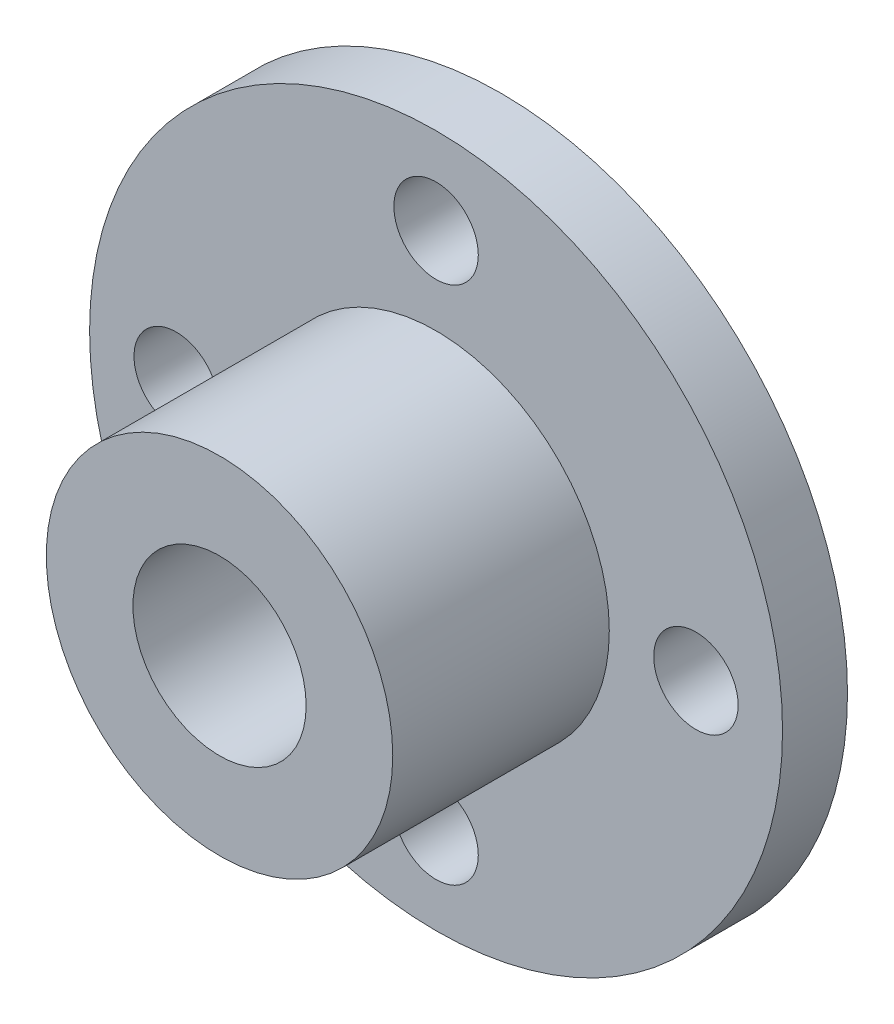
ISO-10303-21;
HEADER;
FILE_DESCRIPTION(('STEP AP214'),'2;1');
FILE_NAME('part.step','',(''),(''),'','','');
FILE_SCHEMA(('AUTOMOTIVE_DESIGN { 1 0 10303 214 1 1 1 1 }'));
ENDSEC;
DATA;
#1=APPLICATION_CONTEXT('core data for automotive mechanical design processes');
#2=APPLICATION_PROTOCOL_DEFINITION('international standard','automotive_design',2000,#1);
#3=PRODUCT_CONTEXT('',#1,'mechanical');
#4=PRODUCT('Part','Part','',(#3));
#5=PRODUCT_RELATED_PRODUCT_CATEGORY('part','',(#4));
#6=PRODUCT_DEFINITION_FORMATION('','',#4);
#7=PRODUCT_DEFINITION_CONTEXT('part definition',#1,'design');
#8=PRODUCT_DEFINITION('design','',#6,#7);
#9=PRODUCT_DEFINITION_SHAPE('','',#8);
#10=(LENGTH_UNIT() NAMED_UNIT(*) SI_UNIT(.MILLI.,.METRE.));
#11=(NAMED_UNIT(*) PLANE_ANGLE_UNIT() SI_UNIT($,.RADIAN.));
#12=(NAMED_UNIT(*) SI_UNIT($,.STERADIAN.) SOLID_ANGLE_UNIT());
#13=UNCERTAINTY_MEASURE_WITH_UNIT(LENGTH_MEASURE(1.E-05),#10,'distance_accuracy_value','');
#14=(GEOMETRIC_REPRESENTATION_CONTEXT(3) GLOBAL_UNCERTAINTY_ASSIGNED_CONTEXT((#13)) GLOBAL_UNIT_ASSIGNED_CONTEXT((#10,
#11,#12)) REPRESENTATION_CONTEXT('',''));
#15=CARTESIAN_POINT('',(0.,0.,0.));
#16=DIRECTION('',(0.,0.,1.));
#17=DIRECTION('',(1.,0.,0.));
#18=AXIS2_PLACEMENT_3D('',#15,#16,#17);
#19=CARTESIAN_POINT('',(0.,0.,3.));
#20=DIRECTION('',(0.,0.,-1.));
#21=DIRECTION('',(-1.,0.,0.));
#22=AXIS2_PLACEMENT_3D('',#19,#20,#21);
#23=CYLINDRICAL_SURFACE('',#22,16.);
#24=CARTESIAN_POINT('',(0.,0.,3.));
#25=DIRECTION('',(0.,0.,1.));
#26=DIRECTION('',(1.,0.,0.));
#27=AXIS2_PLACEMENT_3D('',#24,#25,#26);
#28=CIRCLE('',#27,16.);
#29=CARTESIAN_POINT('',(16.,0.,3.));
#30=VERTEX_POINT('',#29);
#31=EDGE_CURVE('E62',#30,#30,#28,.T.);
#32=ORIENTED_EDGE('',*,*,#31,.F.);
#33=EDGE_LOOP('',(#32));
#34=FACE_BOUND('',#33,.T.);
#35=CARTESIAN_POINT('',(0.,0.,0.));
#36=DIRECTION('',(0.,0.,1.));
#37=DIRECTION('',(1.,0.,0.));
#38=AXIS2_PLACEMENT_3D('',#35,#36,#37);
#39=CIRCLE('',#38,16.);
#40=CARTESIAN_POINT('',(16.,0.,0.));
#41=VERTEX_POINT('',#40);
#42=EDGE_CURVE('E66',#41,#41,#39,.T.);
#43=ORIENTED_EDGE('',*,*,#42,.T.);
#44=EDGE_LOOP('',(#43));
#45=FACE_BOUND('',#44,.T.);
#46=ADVANCED_FACE('F56',(#34,#45),#23,.T.);
#47=CARTESIAN_POINT('',(0.,0.,3.));
#48=DIRECTION('',(0.,0.,1.));
#49=DIRECTION('',(1.,0.,0.));
#50=AXIS2_PLACEMENT_3D('',#47,#48,#49);
#51=PLANE('',#50);
#52=CARTESIAN_POINT('',(0.,12.,3.));
#53=DIRECTION('',(0.,0.,1.));
#54=DIRECTION('',(1.,0.,0.));
#55=AXIS2_PLACEMENT_3D('',#52,#53,#54);
#56=CIRCLE('',#55,1.95);
#57=CARTESIAN_POINT('',(1.95,12.,3.));
#58=VERTEX_POINT('',#57);
#59=EDGE_CURVE('E100',#58,#58,#56,.T.);
#60=ORIENTED_EDGE('',*,*,#59,.F.);
#61=EDGE_LOOP('',(#60));
#62=FACE_BOUND('',#61,.T.);
#63=CARTESIAN_POINT('',(6.77712297852766E-13,-12.,3.));
#64=DIRECTION('',(0.,0.,1.));
#65=DIRECTION('',(1.,0.,0.));
#66=AXIS2_PLACEMENT_3D('',#63,#64,#65);
#67=CIRCLE('',#66,1.95000000000073);
#68=CARTESIAN_POINT('',(1.95000000000141,-12.,3.));
#69=VERTEX_POINT('',#68);
#70=EDGE_CURVE('E97',#69,#69,#67,.T.);
#71=ORIENTED_EDGE('',*,*,#70,.F.);
#72=EDGE_LOOP('',(#71));
#73=FACE_BOUND('',#72,.T.);
#74=CARTESIAN_POINT('',(12.0000000000003,3.37121425450406E-13,3.));
#75=DIRECTION('',(0.,0.,1.));
#76=DIRECTION('',(1.,0.,0.));
#77=AXIS2_PLACEMENT_3D('',#74,#75,#76);
#78=CIRCLE('',#77,1.95000000000026);
#79=CARTESIAN_POINT('',(13.9500000000006,3.37121425450406E-13,3.));
#80=VERTEX_POINT('',#79);
#81=EDGE_CURVE('E91',#80,#80,#78,.T.);
#82=ORIENTED_EDGE('',*,*,#81,.F.);
#83=EDGE_LOOP('',(#82));
#84=FACE_BOUND('',#83,.T.);
#85=CARTESIAN_POINT('',(-11.9999999999997,-3.42060448561337E-13,3.));
#86=DIRECTION('',(0.,0.,1.));
#87=DIRECTION('',(1.,0.,0.));
#88=AXIS2_PLACEMENT_3D('',#85,#86,#87);
#89=CIRCLE('',#88,1.95000000000055);
#90=CARTESIAN_POINT('',(-10.0499999999991,-3.42060448561337E-13,3.));
#91=VERTEX_POINT('',#90);
#92=EDGE_CURVE('E85',#91,#91,#89,.T.);
#93=ORIENTED_EDGE('',*,*,#92,.F.);
#94=EDGE_LOOP('',(#93));
#95=FACE_BOUND('',#94,.T.);
#96=CARTESIAN_POINT('',(0.,0.,3.));
#97=DIRECTION('',(0.,0.,1.));
#98=DIRECTION('',(1.,0.,0.));
#99=AXIS2_PLACEMENT_3D('',#96,#97,#98);
#100=CIRCLE('',#99,8.);
#101=CARTESIAN_POINT('',(8.,0.,3.));
#102=VERTEX_POINT('',#101);
#103=EDGE_CURVE('E73',#102,#102,#100,.T.);
#104=ORIENTED_EDGE('',*,*,#103,.F.);
#105=EDGE_LOOP('',(#104));
#106=FACE_BOUND('',#105,.T.);
#107=ORIENTED_EDGE('',*,*,#31,.T.);
#108=EDGE_LOOP('',(#107));
#109=FACE_BOUND('',#108,.T.);
#110=ADVANCED_FACE('F121',(#62,#73,#84,#95,#106,#109),#51,.T.);
#111=CARTESIAN_POINT('',(0.,0.,0.));
#112=DIRECTION('',(0.,0.,1.));
#113=DIRECTION('',(1.,0.,0.));
#114=AXIS2_PLACEMENT_3D('',#111,#112,#113);
#115=PLANE('',#114);
#116=CARTESIAN_POINT('',(0.,12.,0.));
#117=DIRECTION('',(0.,0.,1.));
#118=DIRECTION('',(1.,0.,0.));
#119=AXIS2_PLACEMENT_3D('',#116,#117,#118);
#120=CIRCLE('',#119,1.95);
#121=CARTESIAN_POINT('',(1.95,12.,0.));
#122=VERTEX_POINT('',#121);
#123=EDGE_CURVE('E81',#122,#122,#120,.T.);
#124=ORIENTED_EDGE('',*,*,#123,.T.);
#125=EDGE_LOOP('',(#124));
#126=FACE_BOUND('',#125,.T.);
#127=CARTESIAN_POINT('',(6.77712297852766E-13,-12.,0.));
#128=DIRECTION('',(0.,0.,1.));
#129=DIRECTION('',(1.,0.,0.));
#130=AXIS2_PLACEMENT_3D('',#127,#128,#129);
#131=CIRCLE('',#130,1.95000000000073);
#132=CARTESIAN_POINT('',(1.95000000000141,-12.,0.));
#133=VERTEX_POINT('',#132);
#134=EDGE_CURVE('E94',#133,#133,#131,.T.);
#135=ORIENTED_EDGE('',*,*,#134,.T.);
#136=EDGE_LOOP('',(#135));
#137=FACE_BOUND('',#136,.T.);
#138=CARTESIAN_POINT('',(12.0000000000003,3.37121425450406E-13,0.));
#139=DIRECTION('',(0.,0.,1.));
#140=DIRECTION('',(1.,0.,0.));
#141=AXIS2_PLACEMENT_3D('',#138,#139,#140);
#142=CIRCLE('',#141,1.95000000000026);
#143=CARTESIAN_POINT('',(13.9500000000006,3.37121425450406E-13,0.));
#144=VERTEX_POINT('',#143);
#145=EDGE_CURVE('E88',#144,#144,#142,.T.);
#146=ORIENTED_EDGE('',*,*,#145,.T.);
#147=EDGE_LOOP('',(#146));
#148=FACE_BOUND('',#147,.T.);
#149=CARTESIAN_POINT('',(-11.9999999999997,-3.42060448561337E-13,0.));
#150=DIRECTION('',(0.,0.,1.));
#151=DIRECTION('',(1.,0.,0.));
#152=AXIS2_PLACEMENT_3D('',#149,#150,#151);
#153=CIRCLE('',#152,1.95000000000055);
#154=CARTESIAN_POINT('',(-10.0499999999991,-3.42060448561337E-13,0.));
#155=VERTEX_POINT('',#154);
#156=EDGE_CURVE('E82',#155,#155,#153,.T.);
#157=ORIENTED_EDGE('',*,*,#156,.T.);
#158=EDGE_LOOP('',(#157));
#159=FACE_BOUND('',#158,.T.);
#160=ORIENTED_EDGE('',*,*,#42,.F.);
#161=EDGE_LOOP('',(#160));
#162=FACE_BOUND('',#161,.T.);
#163=ADVANCED_FACE('F106',(#126,#137,#148,#159,#162),#115,.F.);
#164=CARTESIAN_POINT('',(0.,0.,13.));
#165=DIRECTION('',(0.,0.,1.));
#166=DIRECTION('',(1.,0.,0.));
#167=AXIS2_PLACEMENT_3D('',#164,#165,#166);
#168=PLANE('',#167);
#169=CARTESIAN_POINT('',(0.,0.,13.));
#170=DIRECTION('',(0.,0.,1.));
#171=DIRECTION('',(1.,0.,0.));
#172=AXIS2_PLACEMENT_3D('',#169,#170,#171);
#173=CIRCLE('',#172,8.);
#174=CARTESIAN_POINT('',(8.,0.,13.));
#175=VERTEX_POINT('',#174);
#176=EDGE_CURVE('E71',#175,#175,#173,.T.);
#177=ORIENTED_EDGE('',*,*,#176,.T.);
#178=EDGE_LOOP('',(#177));
#179=FACE_BOUND('',#178,.T.);
#180=CARTESIAN_POINT('',(0.,0.,13.));
#181=DIRECTION('',(0.,0.,1.));
#182=DIRECTION('',(1.,0.,0.));
#183=AXIS2_PLACEMENT_3D('',#180,#181,#182);
#184=CIRCLE('',#183,4.);
#185=CARTESIAN_POINT('',(4.,0.,13.));
#186=VERTEX_POINT('',#185);
#187=EDGE_CURVE('E76',#186,#186,#184,.T.);
#188=ORIENTED_EDGE('',*,*,#187,.F.);
#189=EDGE_LOOP('',(#188));
#190=FACE_BOUND('',#189,.T.);
#191=ADVANCED_FACE('F133',(#179,#190),#168,.T.);
#192=CARTESIAN_POINT('',(0.,0.,13.));
#193=DIRECTION('',(0.,0.,-1.));
#194=DIRECTION('',(-1.,0.,0.));
#195=AXIS2_PLACEMENT_3D('',#192,#193,#194);
#196=CYLINDRICAL_SURFACE('',#195,8.);
#197=ORIENTED_EDGE('',*,*,#176,.F.);
#198=EDGE_LOOP('',(#197));
#199=FACE_BOUND('',#198,.T.);
#200=ORIENTED_EDGE('',*,*,#103,.T.);
#201=EDGE_LOOP('',(#200));
#202=FACE_BOUND('',#201,.T.);
#203=ADVANCED_FACE('F137',(#199,#202),#196,.T.);
#204=CARTESIAN_POINT('',(0.,0.,13.));
#205=DIRECTION('',(0.,0.,-1.));
#206=DIRECTION('',(-1.,0.,0.));
#207=AXIS2_PLACEMENT_3D('',#204,#205,#206);
#208=CYLINDRICAL_SURFACE('',#207,4.);
#209=ORIENTED_EDGE('',*,*,#187,.T.);
#210=EDGE_LOOP('',(#209));
#211=FACE_BOUND('',#210,.T.);
#212=CARTESIAN_POINT('',(0.,0.,3.));
#213=DIRECTION('',(0.,0.,1.));
#214=DIRECTION('',(1.,0.,0.));
#215=AXIS2_PLACEMENT_3D('',#212,#213,#214);
#216=CIRCLE('',#215,4.);
#217=CARTESIAN_POINT('',(4.,0.,3.));
#218=VERTEX_POINT('',#217);
#219=EDGE_CURVE('E11',#218,#218,#216,.F.);
#220=ORIENTED_EDGE('',*,*,#219,.T.);
#221=EDGE_LOOP('',(#220));
#222=FACE_BOUND('',#221,.T.);
#223=ADVANCED_FACE('F142',(#211,#222),#208,.F.);
#224=ORIENTED_EDGE('',*,*,#219,.F.);
#225=EDGE_LOOP('',(#224));
#226=FACE_BOUND('',#225,.T.);
#227=ADVANCED_FACE('F128',(#226),#51,.T.);
#228=CARTESIAN_POINT('',(-11.9999999999997,-3.42060448561337E-13,0.));
#229=DIRECTION('',(0.,0.,1.));
#230=DIRECTION('',(1.,0.,0.));
#231=AXIS2_PLACEMENT_3D('',#228,#229,#230);
#232=CYLINDRICAL_SURFACE('',#231,1.95000000000055);
#233=ORIENTED_EDGE('',*,*,#92,.T.);
#234=EDGE_LOOP('',(#233));
#235=FACE_BOUND('',#234,.T.);
#236=ORIENTED_EDGE('',*,*,#156,.F.);
#237=EDGE_LOOP('',(#236));
#238=FACE_BOUND('',#237,.T.);
#239=ADVANCED_FACE('F148',(#235,#238),#232,.F.);
#240=CARTESIAN_POINT('',(12.0000000000003,3.37121425450406E-13,0.));
#241=DIRECTION('',(0.,0.,1.));
#242=DIRECTION('',(1.,0.,0.));
#243=AXIS2_PLACEMENT_3D('',#240,#241,#242);
#244=CYLINDRICAL_SURFACE('',#243,1.95000000000026);
#245=ORIENTED_EDGE('',*,*,#145,.F.);
#246=EDGE_LOOP('',(#245));
#247=FACE_BOUND('',#246,.T.);
#248=ORIENTED_EDGE('',*,*,#81,.T.);
#249=EDGE_LOOP('',(#248));
#250=FACE_BOUND('',#249,.T.);
#251=ADVANCED_FACE('F117',(#247,#250),#244,.F.);
#252=CARTESIAN_POINT('',(6.77712297852766E-13,-12.,0.));
#253=DIRECTION('',(0.,0.,1.));
#254=DIRECTION('',(1.,0.,0.));
#255=AXIS2_PLACEMENT_3D('',#252,#253,#254);
#256=CYLINDRICAL_SURFACE('',#255,1.95000000000073);
#257=ORIENTED_EDGE('',*,*,#134,.F.);
#258=EDGE_LOOP('',(#257));
#259=FACE_BOUND('',#258,.T.);
#260=ORIENTED_EDGE('',*,*,#70,.T.);
#261=EDGE_LOOP('',(#260));
#262=FACE_BOUND('',#261,.T.);
#263=ADVANCED_FACE('F111',(#259,#262),#256,.F.);
#264=CARTESIAN_POINT('',(0.,12.,0.));
#265=DIRECTION('',(0.,0.,1.));
#266=DIRECTION('',(1.,0.,0.));
#267=AXIS2_PLACEMENT_3D('',#264,#265,#266);
#268=CYLINDRICAL_SURFACE('',#267,1.95);
#269=ORIENTED_EDGE('',*,*,#59,.T.);
#270=EDGE_LOOP('',(#269));
#271=FACE_BOUND('',#270,.T.);
#272=ORIENTED_EDGE('',*,*,#123,.F.);
#273=EDGE_LOOP('',(#272));
#274=FACE_BOUND('',#273,.T.);
#275=ADVANCED_FACE('F109',(#271,#274),#268,.F.);
#276=CLOSED_SHELL('',(#46,#110,#163,#191,#203,#223,#227,#239,#251,#263,#275));
#277=MANIFOLD_SOLID_BREP('B2',#276);
#278=ADVANCED_BREP_SHAPE_REPRESENTATION('',(#18,#277),#14);
#279=SHAPE_DEFINITION_REPRESENTATION(#9,#278);
ENDSEC;
END-ISO-10303-21;
